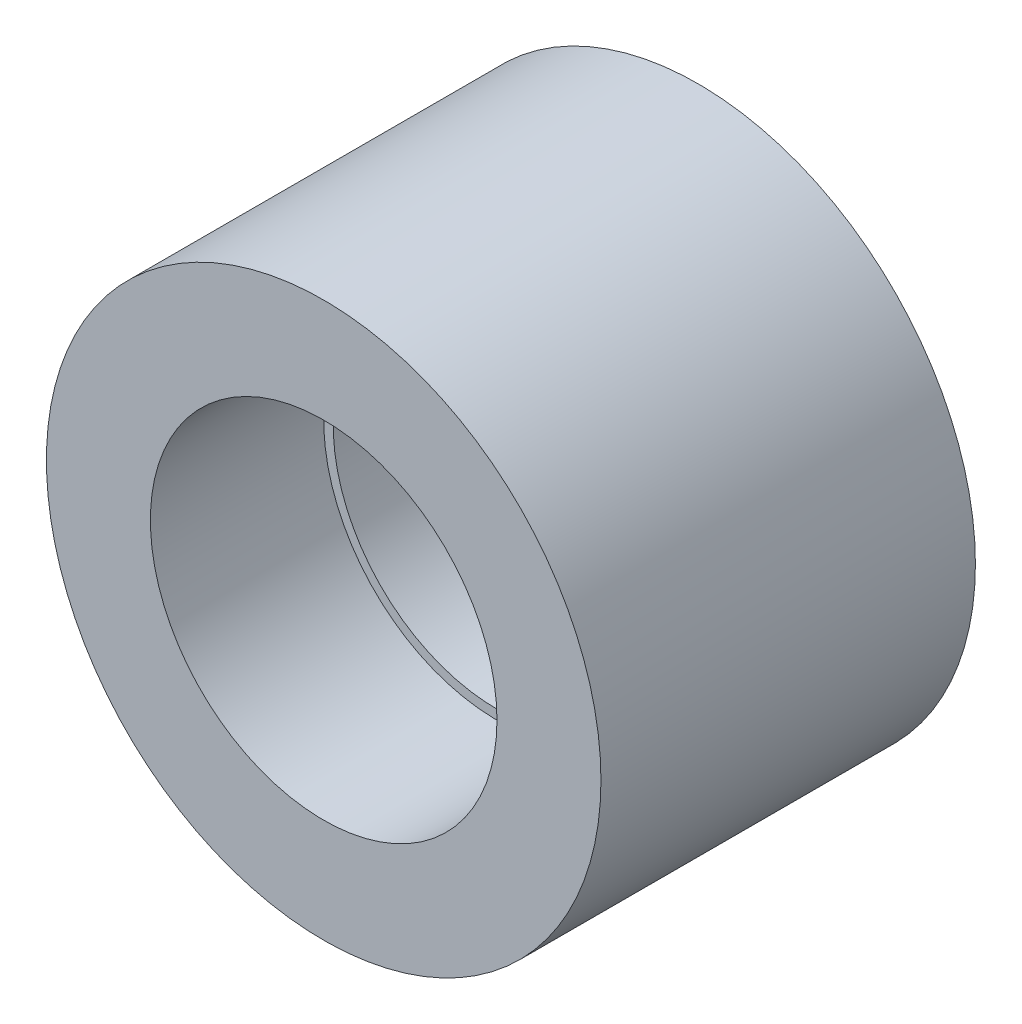
ISO-10303-21;
HEADER;
FILE_DESCRIPTION(('STEP AP214'),'2;1');
FILE_NAME('part.step','',(''),(''),'','','');
FILE_SCHEMA(('AUTOMOTIVE_DESIGN { 1 0 10303 214 1 1 1 1 }'));
ENDSEC;
DATA;
#1=APPLICATION_CONTEXT('core data for automotive mechanical design processes');
#2=APPLICATION_PROTOCOL_DEFINITION('international standard','automotive_design',2000,#1);
#3=PRODUCT_CONTEXT('',#1,'mechanical');
#4=PRODUCT('Part','Part','',(#3));
#5=PRODUCT_RELATED_PRODUCT_CATEGORY('part','',(#4));
#6=PRODUCT_DEFINITION_FORMATION('','',#4);
#7=PRODUCT_DEFINITION_CONTEXT('part definition',#1,'design');
#8=PRODUCT_DEFINITION('design','',#6,#7);
#9=PRODUCT_DEFINITION_SHAPE('','',#8);
#10=(LENGTH_UNIT() NAMED_UNIT(*) SI_UNIT(.MILLI.,.METRE.));
#11=(NAMED_UNIT(*) PLANE_ANGLE_UNIT() SI_UNIT($,.RADIAN.));
#12=(NAMED_UNIT(*) SI_UNIT($,.STERADIAN.) SOLID_ANGLE_UNIT());
#13=UNCERTAINTY_MEASURE_WITH_UNIT(LENGTH_MEASURE(1.E-05),#10,'distance_accuracy_value','');
#14=(GEOMETRIC_REPRESENTATION_CONTEXT(3) GLOBAL_UNCERTAINTY_ASSIGNED_CONTEXT((#13)) GLOBAL_UNIT_ASSIGNED_CONTEXT((#10,
#11,#12)) REPRESENTATION_CONTEXT('',''));
#15=CARTESIAN_POINT('',(0.,0.,0.));
#16=DIRECTION('',(0.,0.,1.));
#17=DIRECTION('',(1.,0.,0.));
#18=AXIS2_PLACEMENT_3D('',#15,#16,#17);
#19=CARTESIAN_POINT('',(0.,0.,3.175));
#20=DIRECTION('',(0.,0.,-1.));
#21=DIRECTION('',(-1.,0.,0.));
#22=AXIS2_PLACEMENT_3D('',#19,#20,#21);
#23=CYLINDRICAL_SURFACE('',#22,3.175);
#24=CARTESIAN_POINT('',(0.,0.,3.175));
#25=DIRECTION('',(0.,0.,1.));
#26=DIRECTION('',(1.,0.,0.));
#27=AXIS2_PLACEMENT_3D('',#24,#25,#26);
#28=CIRCLE('',#27,3.175);
#29=CARTESIAN_POINT('',(3.175,0.,3.175));
#30=VERTEX_POINT('',#29);
#31=EDGE_CURVE('E51',#30,#30,#28,.T.);
#32=ORIENTED_EDGE('',*,*,#31,.T.);
#33=EDGE_LOOP('',(#32));
#34=FACE_BOUND('',#33,.T.);
#35=CARTESIAN_POINT('',(0.,0.,0.));
#36=DIRECTION('',(0.,0.,1.));
#37=DIRECTION('',(1.,0.,0.));
#38=AXIS2_PLACEMENT_3D('',#35,#36,#37);
#39=CIRCLE('',#38,3.175);
#40=CARTESIAN_POINT('',(3.175,0.,0.));
#41=VERTEX_POINT('',#40);
#42=EDGE_CURVE('E46',#41,#41,#39,.T.);
#43=ORIENTED_EDGE('',*,*,#42,.F.);
#44=EDGE_LOOP('',(#43));
#45=FACE_BOUND('',#44,.T.);
#46=ADVANCED_FACE('F43',(#34,#45),#23,.F.);
#47=CARTESIAN_POINT('',(0.,0.,3.175));
#48=DIRECTION('',(0.,0.,-1.));
#49=DIRECTION('',(-1.,0.,0.));
#50=AXIS2_PLACEMENT_3D('',#47,#48,#49);
#51=CYLINDRICAL_SURFACE('',#50,5.08);
#52=CARTESIAN_POINT('',(0.,0.,3.175));
#53=DIRECTION('',(0.,0.,1.));
#54=DIRECTION('',(1.,0.,0.));
#55=AXIS2_PLACEMENT_3D('',#52,#53,#54);
#56=CIRCLE('',#55,5.08);
#57=CARTESIAN_POINT('',(5.08,0.,3.175));
#58=VERTEX_POINT('',#57);
#59=EDGE_CURVE('E10',#58,#58,#56,.T.);
#60=ORIENTED_EDGE('',*,*,#59,.F.);
#61=EDGE_LOOP('',(#60));
#62=FACE_BOUND('',#61,.T.);
#63=CARTESIAN_POINT('',(0.,0.,-3.68554));
#64=DIRECTION('',(0.,0.,1.));
#65=DIRECTION('',(1.,0.,0.));
#66=AXIS2_PLACEMENT_3D('',#63,#64,#65);
#67=CIRCLE('',#66,5.08);
#68=CARTESIAN_POINT('',(5.08,0.,-3.68554));
#69=VERTEX_POINT('',#68);
#70=EDGE_CURVE('E61',#69,#69,#67,.T.);
#71=ORIENTED_EDGE('',*,*,#70,.T.);
#72=EDGE_LOOP('',(#71));
#73=FACE_BOUND('',#72,.T.);
#74=ADVANCED_FACE('F89',(#62,#73),#51,.T.);
#75=CARTESIAN_POINT('',(0.,0.,3.175));
#76=DIRECTION('',(0.,0.,1.));
#77=DIRECTION('',(1.,0.,0.));
#78=AXIS2_PLACEMENT_3D('',#75,#76,#77);
#79=PLANE('',#78);
#80=ORIENTED_EDGE('',*,*,#31,.F.);
#81=EDGE_LOOP('',(#80));
#82=FACE_BOUND('',#81,.T.);
#83=ORIENTED_EDGE('',*,*,#59,.T.);
#84=EDGE_LOOP('',(#83));
#85=FACE_BOUND('',#84,.T.);
#86=ADVANCED_FACE('F81',(#82,#85),#79,.T.);
#87=CARTESIAN_POINT('',(0.,0.,0.));
#88=DIRECTION('',(0.,0.,1.));
#89=DIRECTION('',(1.,0.,0.));
#90=AXIS2_PLACEMENT_3D('',#87,#88,#89);
#91=PLANE('',#90);
#92=CARTESIAN_POINT('',(0.,0.,0.));
#93=DIRECTION('',(0.,0.,1.));
#94=DIRECTION('',(1.,0.,0.));
#95=AXIS2_PLACEMENT_3D('',#92,#93,#94);
#96=CIRCLE('',#95,3.);
#97=CARTESIAN_POINT('',(3.,0.,0.));
#98=VERTEX_POINT('',#97);
#99=EDGE_CURVE('E59',#98,#98,#96,.T.);
#100=ORIENTED_EDGE('',*,*,#99,.F.);
#101=EDGE_LOOP('',(#100));
#102=FACE_BOUND('',#101,.T.);
#103=ORIENTED_EDGE('',*,*,#42,.T.);
#104=EDGE_LOOP('',(#103));
#105=FACE_BOUND('',#104,.T.);
#106=ADVANCED_FACE('F77',(#102,#105),#91,.T.);
#107=CARTESIAN_POINT('',(0.,0.,-3.68554));
#108=DIRECTION('',(0.,0.,1.));
#109=DIRECTION('',(1.,0.,0.));
#110=AXIS2_PLACEMENT_3D('',#107,#108,#109);
#111=CYLINDRICAL_SURFACE('',#110,3.);
#112=CARTESIAN_POINT('',(0.,0.,-3.68554));
#113=DIRECTION('',(0.,0.,1.));
#114=DIRECTION('',(1.,0.,0.));
#115=AXIS2_PLACEMENT_3D('',#112,#113,#114);
#116=CIRCLE('',#115,3.);
#117=CARTESIAN_POINT('',(3.,0.,-3.68554));
#118=VERTEX_POINT('',#117);
#119=EDGE_CURVE('E65',#118,#118,#116,.T.);
#120=ORIENTED_EDGE('',*,*,#119,.F.);
#121=EDGE_LOOP('',(#120));
#122=FACE_BOUND('',#121,.T.);
#123=ORIENTED_EDGE('',*,*,#99,.T.);
#124=EDGE_LOOP('',(#123));
#125=FACE_BOUND('',#124,.T.);
#126=ADVANCED_FACE('F72',(#122,#125),#111,.F.);
#127=CARTESIAN_POINT('',(0.,0.,-3.68554));
#128=DIRECTION('',(0.,0.,1.));
#129=DIRECTION('',(1.,0.,0.));
#130=AXIS2_PLACEMENT_3D('',#127,#128,#129);
#131=PLANE('',#130);
#132=ORIENTED_EDGE('',*,*,#119,.T.);
#133=EDGE_LOOP('',(#132));
#134=FACE_BOUND('',#133,.T.);
#135=ORIENTED_EDGE('',*,*,#70,.F.);
#136=EDGE_LOOP('',(#135));
#137=FACE_BOUND('',#136,.T.);
#138=ADVANCED_FACE('F73',(#134,#137),#131,.F.);
#139=CLOSED_SHELL('',(#46,#74,#86,#106,#126,#138));
#140=MANIFOLD_SOLID_BREP('B2',#139);
#141=ADVANCED_BREP_SHAPE_REPRESENTATION('',(#18,#140),#14);
#142=SHAPE_DEFINITION_REPRESENTATION(#9,#141);
ENDSEC;
END-ISO-10303-21;
